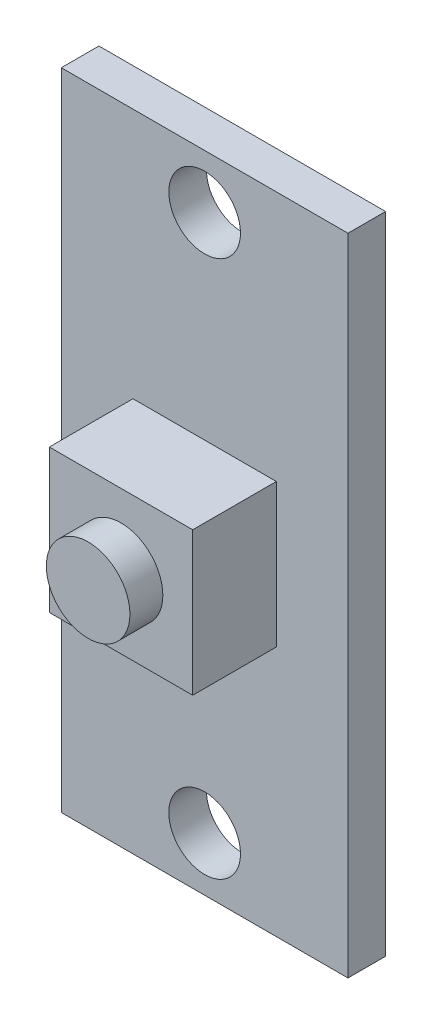
ISO-10303-21;
HEADER;
FILE_DESCRIPTION(('STEP AP214'),'2;1');
FILE_NAME('part.step','',(''),(''),'','','');
FILE_SCHEMA(('AUTOMOTIVE_DESIGN { 1 0 10303 214 1 1 1 1 }'));
ENDSEC;
DATA;
#1=APPLICATION_CONTEXT('core data for automotive mechanical design processes');
#2=APPLICATION_PROTOCOL_DEFINITION('international standard','automotive_design',2000,#1);
#3=PRODUCT_CONTEXT('',#1,'mechanical');
#4=PRODUCT('Part','Part','',(#3));
#5=PRODUCT_RELATED_PRODUCT_CATEGORY('part','',(#4));
#6=PRODUCT_DEFINITION_FORMATION('','',#4);
#7=PRODUCT_DEFINITION_CONTEXT('part definition',#1,'design');
#8=PRODUCT_DEFINITION('design','',#6,#7);
#9=PRODUCT_DEFINITION_SHAPE('','',#8);
#10=(LENGTH_UNIT() NAMED_UNIT(*) SI_UNIT(.MILLI.,.METRE.));
#11=(NAMED_UNIT(*) PLANE_ANGLE_UNIT() SI_UNIT($,.RADIAN.));
#12=(NAMED_UNIT(*) SI_UNIT($,.STERADIAN.) SOLID_ANGLE_UNIT());
#13=UNCERTAINTY_MEASURE_WITH_UNIT(LENGTH_MEASURE(1.E-05),#10,'distance_accuracy_value','');
#14=(GEOMETRIC_REPRESENTATION_CONTEXT(3) GLOBAL_UNCERTAINTY_ASSIGNED_CONTEXT((#13)) GLOBAL_UNIT_ASSIGNED_CONTEXT((#10,
#11,#12)) REPRESENTATION_CONTEXT('',''));
#15=CARTESIAN_POINT('',(0.,0.,0.));
#16=DIRECTION('',(0.,0.,1.));
#17=DIRECTION('',(1.,0.,0.));
#18=AXIS2_PLACEMENT_3D('',#15,#16,#17);
#19=CARTESIAN_POINT('',(0.,0.,1.6002));
#20=DIRECTION('',(0.,0.,-1.));
#21=DIRECTION('',(-1.,0.,0.));
#22=AXIS2_PLACEMENT_3D('',#19,#20,#21);
#23=PLANE('',#22);
#24=CARTESIAN_POINT('',(0.,11.43,1.6002));
#25=DIRECTION('',(0.,0.,-1.));
#26=DIRECTION('',(-1.,0.,0.));
#27=AXIS2_PLACEMENT_3D('',#24,#25,#26);
#28=CIRCLE('',#27,1.524);
#29=CARTESIAN_POINT('',(-1.524,11.43,1.6002));
#30=VERTEX_POINT('',#29);
#31=EDGE_CURVE('E295',#30,#30,#28,.T.);
#32=ORIENTED_EDGE('',*,*,#31,.T.);
#33=EDGE_LOOP('',(#32));
#34=FACE_BOUND('',#33,.T.);
#35=CARTESIAN_POINT('',(0.,-11.43,1.6002));
#36=DIRECTION('',(0.,0.,-1.));
#37=DIRECTION('',(-1.,0.,0.));
#38=AXIS2_PLACEMENT_3D('',#35,#36,#37);
#39=CIRCLE('',#38,1.524);
#40=CARTESIAN_POINT('',(-1.524,-11.43,1.6002));
#41=VERTEX_POINT('',#40);
#42=EDGE_CURVE('E291',#41,#41,#39,.T.);
#43=ORIENTED_EDGE('',*,*,#42,.T.);
#44=EDGE_LOOP('',(#43));
#45=FACE_BOUND('',#44,.T.);
#46=DIRECTION('',(0.,1.,0.));
#47=VECTOR('',#46,1.);
#48=CARTESIAN_POINT('',(6.096,-13.716,1.6002));
#49=LINE('',#48,#47);
#50=CARTESIAN_POINT('',(6.096,-13.716,1.6002));
#51=VERTEX_POINT('',#50);
#52=CARTESIAN_POINT('',(6.096,13.716,1.6002));
#53=VERTEX_POINT('',#52);
#54=EDGE_CURVE('E128',#51,#53,#49,.T.);
#55=ORIENTED_EDGE('',*,*,#54,.T.);
#56=DIRECTION('',(-1.,0.,0.));
#57=VECTOR('',#56,1.);
#58=CARTESIAN_POINT('',(-6.096,13.716,1.6002));
#59=LINE('',#58,#57);
#60=CARTESIAN_POINT('',(-6.096,13.716,1.6002));
#61=VERTEX_POINT('',#60);
#62=EDGE_CURVE('E131',#53,#61,#59,.T.);
#63=ORIENTED_EDGE('',*,*,#62,.T.);
#64=DIRECTION('',(0.,-1.,0.));
#65=VECTOR('',#64,1.);
#66=CARTESIAN_POINT('',(-6.096,-13.716,1.6002));
#67=LINE('',#66,#65);
#68=CARTESIAN_POINT('',(-6.096,-13.716,1.6002));
#69=VERTEX_POINT('',#68);
#70=EDGE_CURVE('E134',#61,#69,#67,.T.);
#71=ORIENTED_EDGE('',*,*,#70,.T.);
#72=DIRECTION('',(1.,0.,0.));
#73=VECTOR('',#72,1.);
#74=CARTESIAN_POINT('',(-6.096,-13.716,1.6002));
#75=LINE('',#74,#73);
#76=EDGE_CURVE('E136',#69,#51,#75,.T.);
#77=ORIENTED_EDGE('',*,*,#76,.T.);
#78=EDGE_LOOP('',(#55,#63,#71,#77));
#79=FACE_BOUND('',#78,.T.);
#80=DIRECTION('',(0.,-1.,0.));
#81=VECTOR('',#80,1.);
#82=CARTESIAN_POINT('',(-3.048,3.048,1.6002));
#83=LINE('',#82,#81);
#84=CARTESIAN_POINT('',(-3.048,3.048,1.6002));
#85=VERTEX_POINT('',#84);
#86=CARTESIAN_POINT('',(-3.048,-3.048,1.6002));
#87=VERTEX_POINT('',#86);
#88=EDGE_CURVE('E49',#85,#87,#83,.T.);
#89=ORIENTED_EDGE('',*,*,#88,.F.);
#90=DIRECTION('',(-1.,0.,0.));
#91=VECTOR('',#90,1.);
#92=CARTESIAN_POINT('',(-3.048,3.048,1.6002));
#93=LINE('',#92,#91);
#94=CARTESIAN_POINT('',(3.048,3.048,1.6002));
#95=VERTEX_POINT('',#94);
#96=EDGE_CURVE('E53',#95,#85,#93,.T.);
#97=ORIENTED_EDGE('',*,*,#96,.F.);
#98=DIRECTION('',(0.,1.,0.));
#99=VECTOR('',#98,1.);
#100=CARTESIAN_POINT('',(3.048,3.048,1.6002));
#101=LINE('',#100,#99);
#102=CARTESIAN_POINT('',(3.048,-3.048,1.6002));
#103=VERTEX_POINT('',#102);
#104=EDGE_CURVE('E303',#103,#95,#101,.T.);
#105=ORIENTED_EDGE('',*,*,#104,.F.);
#106=DIRECTION('',(1.,0.,0.));
#107=VECTOR('',#106,1.);
#108=CARTESIAN_POINT('',(-3.048,-3.048,1.6002));
#109=LINE('',#108,#107);
#110=EDGE_CURVE('E301',#87,#103,#109,.T.);
#111=ORIENTED_EDGE('',*,*,#110,.F.);
#112=EDGE_LOOP('',(#89,#97,#105,#111));
#113=FACE_BOUND('',#112,.T.);
#114=ADVANCED_FACE('F33',(#34,#45,#79,#113),#23,.F.);
#115=CARTESIAN_POINT('',(6.096,-13.716,1.6002));
#116=DIRECTION('',(-1.,0.,0.));
#117=DIRECTION('',(0.,0.,1.));
#118=AXIS2_PLACEMENT_3D('',#115,#116,#117);
#119=PLANE('',#118);
#120=DIRECTION('',(0.,1.,0.));
#121=VECTOR('',#120,1.);
#122=CARTESIAN_POINT('',(6.096,-13.716,0.));
#123=LINE('',#122,#121);
#124=CARTESIAN_POINT('',(6.096,-13.716,0.));
#125=VERTEX_POINT('',#124);
#126=CARTESIAN_POINT('',(6.096,13.716,0.));
#127=VERTEX_POINT('',#126);
#128=EDGE_CURVE('E119',#125,#127,#123,.T.);
#129=ORIENTED_EDGE('',*,*,#128,.T.);
#130=DIRECTION('',(0.,0.,-1.));
#131=VECTOR('',#130,1.);
#132=CARTESIAN_POINT('',(6.096,13.716,1.6002));
#133=LINE('',#132,#131);
#134=EDGE_CURVE('E37',#53,#127,#133,.T.);
#135=ORIENTED_EDGE('',*,*,#134,.F.);
#136=ORIENTED_EDGE('',*,*,#54,.F.);
#137=DIRECTION('',(0.,0.,-1.));
#138=VECTOR('',#137,1.);
#139=CARTESIAN_POINT('',(6.096,-13.716,1.6002));
#140=LINE('',#139,#138);
#141=EDGE_CURVE('E137',#51,#125,#140,.T.);
#142=ORIENTED_EDGE('',*,*,#141,.T.);
#143=EDGE_LOOP('',(#129,#135,#136,#142));
#144=FACE_BOUND('',#143,.T.);
#145=ADVANCED_FACE('F35',(#144),#119,.F.);
#146=CARTESIAN_POINT('',(-6.096,13.716,1.6002));
#147=DIRECTION('',(0.,-1.,0.));
#148=DIRECTION('',(0.,0.,-1.));
#149=AXIS2_PLACEMENT_3D('',#146,#147,#148);
#150=PLANE('',#149);
#151=DIRECTION('',(-1.,0.,0.));
#152=VECTOR('',#151,1.);
#153=CARTESIAN_POINT('',(-6.096,13.716,0.));
#154=LINE('',#153,#152);
#155=CARTESIAN_POINT('',(-6.096,13.716,0.));
#156=VERTEX_POINT('',#155);
#157=EDGE_CURVE('E122',#127,#156,#154,.T.);
#158=ORIENTED_EDGE('',*,*,#157,.T.);
#159=DIRECTION('',(0.,0.,-1.));
#160=VECTOR('',#159,1.);
#161=CARTESIAN_POINT('',(-6.096,13.716,1.6002));
#162=LINE('',#161,#160);
#163=EDGE_CURVE('E147',#61,#156,#162,.T.);
#164=ORIENTED_EDGE('',*,*,#163,.F.);
#165=ORIENTED_EDGE('',*,*,#62,.F.);
#166=ORIENTED_EDGE('',*,*,#134,.T.);
#167=EDGE_LOOP('',(#158,#164,#165,#166));
#168=FACE_BOUND('',#167,.T.);
#169=ADVANCED_FACE('F156',(#168),#150,.F.);
#170=CARTESIAN_POINT('',(-6.096,-13.716,1.6002));
#171=DIRECTION('',(1.,0.,0.));
#172=DIRECTION('',(0.,0.,-1.));
#173=AXIS2_PLACEMENT_3D('',#170,#171,#172);
#174=PLANE('',#173);
#175=DIRECTION('',(0.,-1.,0.));
#176=VECTOR('',#175,1.);
#177=CARTESIAN_POINT('',(-6.096,-13.716,0.));
#178=LINE('',#177,#176);
#179=CARTESIAN_POINT('',(-6.096,-13.716,0.));
#180=VERTEX_POINT('',#179);
#181=EDGE_CURVE('E140',#156,#180,#178,.T.);
#182=ORIENTED_EDGE('',*,*,#181,.T.);
#183=DIRECTION('',(0.,0.,-1.));
#184=VECTOR('',#183,1.);
#185=CARTESIAN_POINT('',(-6.096,-13.716,1.6002));
#186=LINE('',#185,#184);
#187=EDGE_CURVE('E145',#69,#180,#186,.T.);
#188=ORIENTED_EDGE('',*,*,#187,.F.);
#189=ORIENTED_EDGE('',*,*,#70,.F.);
#190=ORIENTED_EDGE('',*,*,#163,.T.);
#191=EDGE_LOOP('',(#182,#188,#189,#190));
#192=FACE_BOUND('',#191,.T.);
#193=ADVANCED_FACE('F165',(#192),#174,.F.);
#194=CARTESIAN_POINT('',(-6.096,-13.716,1.6002));
#195=DIRECTION('',(0.,1.,0.));
#196=DIRECTION('',(0.,0.,1.));
#197=AXIS2_PLACEMENT_3D('',#194,#195,#196);
#198=PLANE('',#197);
#199=DIRECTION('',(1.,0.,0.));
#200=VECTOR('',#199,1.);
#201=CARTESIAN_POINT('',(-6.096,-13.716,0.));
#202=LINE('',#201,#200);
#203=EDGE_CURVE('E132',#180,#125,#202,.T.);
#204=ORIENTED_EDGE('',*,*,#203,.T.);
#205=ORIENTED_EDGE('',*,*,#141,.F.);
#206=ORIENTED_EDGE('',*,*,#76,.F.);
#207=ORIENTED_EDGE('',*,*,#187,.T.);
#208=EDGE_LOOP('',(#204,#205,#206,#207));
#209=FACE_BOUND('',#208,.T.);
#210=ADVANCED_FACE('F168',(#209),#198,.F.);
#211=CARTESIAN_POINT('',(0.,0.,0.));
#212=DIRECTION('',(0.,0.,-1.));
#213=DIRECTION('',(-1.,0.,0.));
#214=AXIS2_PLACEMENT_3D('',#211,#212,#213);
#215=PLANE('',#214);
#216=CARTESIAN_POINT('',(0.,11.43,0.));
#217=DIRECTION('',(0.,0.,1.));
#218=DIRECTION('',(1.,0.,0.));
#219=AXIS2_PLACEMENT_3D('',#216,#217,#218);
#220=CIRCLE('',#219,1.524);
#221=CARTESIAN_POINT('',(1.524,11.43,0.));
#222=VERTEX_POINT('',#221);
#223=EDGE_CURVE('E287',#222,#222,#220,.T.);
#224=ORIENTED_EDGE('',*,*,#223,.T.);
#225=EDGE_LOOP('',(#224));
#226=FACE_BOUND('',#225,.T.);
#227=CARTESIAN_POINT('',(0.,-11.43,0.));
#228=DIRECTION('',(0.,0.,1.));
#229=DIRECTION('',(1.,0.,0.));
#230=AXIS2_PLACEMENT_3D('',#227,#228,#229);
#231=CIRCLE('',#230,1.524);
#232=CARTESIAN_POINT('',(1.524,-11.43,0.));
#233=VERTEX_POINT('',#232);
#234=EDGE_CURVE('E284',#233,#233,#231,.T.);
#235=ORIENTED_EDGE('',*,*,#234,.T.);
#236=EDGE_LOOP('',(#235));
#237=FACE_BOUND('',#236,.T.);
#238=ORIENTED_EDGE('',*,*,#128,.F.);
#239=ORIENTED_EDGE('',*,*,#203,.F.);
#240=ORIENTED_EDGE('',*,*,#181,.F.);
#241=ORIENTED_EDGE('',*,*,#157,.F.);
#242=EDGE_LOOP('',(#238,#239,#240,#241));
#243=FACE_BOUND('',#242,.T.);
#244=ADVANCED_FACE('F163',(#226,#237,#243),#215,.T.);
#245=CARTESIAN_POINT('',(-3.048,3.048,5.1562));
#246=DIRECTION('',(1.,0.,0.));
#247=DIRECTION('',(0.,1.,0.));
#248=AXIS2_PLACEMENT_3D('',#245,#246,#247);
#249=PLANE('',#248);
#250=ORIENTED_EDGE('',*,*,#88,.T.);
#251=DIRECTION('',(0.,0.,-1.));
#252=VECTOR('',#251,1.);
#253=CARTESIAN_POINT('',(-3.048,-3.048,5.1562));
#254=LINE('',#253,#252);
#255=CARTESIAN_POINT('',(-3.048,-3.048,5.1562));
#256=VERTEX_POINT('',#255);
#257=EDGE_CURVE('E102',#256,#87,#254,.T.);
#258=ORIENTED_EDGE('',*,*,#257,.F.);
#259=DIRECTION('',(0.,-1.,0.));
#260=VECTOR('',#259,1.);
#261=CARTESIAN_POINT('',(-3.048,3.048,5.1562));
#262=LINE('',#261,#260);
#263=CARTESIAN_POINT('',(-3.048,3.048,5.1562));
#264=VERTEX_POINT('',#263);
#265=EDGE_CURVE('E108',#264,#256,#262,.T.);
#266=ORIENTED_EDGE('',*,*,#265,.F.);
#267=DIRECTION('',(0.,0.,-1.));
#268=VECTOR('',#267,1.);
#269=CARTESIAN_POINT('',(-3.048,3.048,5.1562));
#270=LINE('',#269,#268);
#271=EDGE_CURVE('E299',#264,#85,#270,.T.);
#272=ORIENTED_EDGE('',*,*,#271,.T.);
#273=EDGE_LOOP('',(#250,#258,#266,#272));
#274=FACE_BOUND('',#273,.T.);
#275=ADVANCED_FACE('F118',(#274),#249,.F.);
#276=CARTESIAN_POINT('',(-3.048,-3.048,5.1562));
#277=DIRECTION('',(0.,1.,0.));
#278=DIRECTION('',(-1.,0.,0.));
#279=AXIS2_PLACEMENT_3D('',#276,#277,#278);
#280=PLANE('',#279);
#281=ORIENTED_EDGE('',*,*,#110,.T.);
#282=DIRECTION('',(0.,0.,-1.));
#283=VECTOR('',#282,1.);
#284=CARTESIAN_POINT('',(3.048,-3.048,5.1562));
#285=LINE('',#284,#283);
#286=CARTESIAN_POINT('',(3.048,-3.048,5.1562));
#287=VERTEX_POINT('',#286);
#288=EDGE_CURVE('E104',#287,#103,#285,.T.);
#289=ORIENTED_EDGE('',*,*,#288,.F.);
#290=DIRECTION('',(1.,0.,0.));
#291=VECTOR('',#290,1.);
#292=CARTESIAN_POINT('',(-3.048,-3.048,5.1562));
#293=LINE('',#292,#291);
#294=EDGE_CURVE('E97',#256,#287,#293,.T.);
#295=ORIENTED_EDGE('',*,*,#294,.F.);
#296=ORIENTED_EDGE('',*,*,#257,.T.);
#297=EDGE_LOOP('',(#281,#289,#295,#296));
#298=FACE_BOUND('',#297,.T.);
#299=ADVANCED_FACE('F100',(#298),#280,.F.);
#300=CARTESIAN_POINT('',(3.048,3.048,5.1562));
#301=DIRECTION('',(-1.,0.,0.));
#302=DIRECTION('',(0.,-1.,0.));
#303=AXIS2_PLACEMENT_3D('',#300,#301,#302);
#304=PLANE('',#303);
#305=ORIENTED_EDGE('',*,*,#104,.T.);
#306=DIRECTION('',(0.,0.,-1.));
#307=VECTOR('',#306,1.);
#308=CARTESIAN_POINT('',(3.048,3.048,5.1562));
#309=LINE('',#308,#307);
#310=CARTESIAN_POINT('',(3.048,3.048,5.1562));
#311=VERTEX_POINT('',#310);
#312=EDGE_CURVE('E124',#311,#95,#309,.T.);
#313=ORIENTED_EDGE('',*,*,#312,.F.);
#314=DIRECTION('',(0.,1.,0.));
#315=VECTOR('',#314,1.);
#316=CARTESIAN_POINT('',(3.048,3.048,5.1562));
#317=LINE('',#316,#315);
#318=EDGE_CURVE('E107',#287,#311,#317,.T.);
#319=ORIENTED_EDGE('',*,*,#318,.F.);
#320=ORIENTED_EDGE('',*,*,#288,.T.);
#321=EDGE_LOOP('',(#305,#313,#319,#320));
#322=FACE_BOUND('',#321,.T.);
#323=ADVANCED_FACE('F216',(#322),#304,.F.);
#324=CARTESIAN_POINT('',(-3.048,3.048,5.1562));
#325=DIRECTION('',(0.,-1.,0.));
#326=DIRECTION('',(0.,0.,-1.));
#327=AXIS2_PLACEMENT_3D('',#324,#325,#326);
#328=PLANE('',#327);
#329=ORIENTED_EDGE('',*,*,#96,.T.);
#330=ORIENTED_EDGE('',*,*,#271,.F.);
#331=DIRECTION('',(-1.,0.,0.));
#332=VECTOR('',#331,1.);
#333=CARTESIAN_POINT('',(-3.048,3.048,5.1562));
#334=LINE('',#333,#332);
#335=EDGE_CURVE('E113',#311,#264,#334,.T.);
#336=ORIENTED_EDGE('',*,*,#335,.F.);
#337=ORIENTED_EDGE('',*,*,#312,.T.);
#338=EDGE_LOOP('',(#329,#330,#336,#337));
#339=FACE_BOUND('',#338,.T.);
#340=ADVANCED_FACE('F222',(#339),#328,.F.);
#341=CARTESIAN_POINT('',(0.,0.,5.1562));
#342=DIRECTION('',(0.,0.,1.));
#343=DIRECTION('',(1.,0.,0.));
#344=AXIS2_PLACEMENT_3D('',#341,#342,#343);
#345=PLANE('',#344);
#346=CARTESIAN_POINT('',(0.,0.,5.1562));
#347=DIRECTION('',(0.,0.,1.));
#348=DIRECTION('',(1.,0.,0.));
#349=AXIS2_PLACEMENT_3D('',#346,#347,#348);
#350=CIRCLE('',#349,1.778);
#351=CARTESIAN_POINT('',(1.778,0.,5.1562));
#352=VERTEX_POINT('',#351);
#353=EDGE_CURVE('E11',#352,#352,#350,.T.);
#354=ORIENTED_EDGE('',*,*,#353,.F.);
#355=EDGE_LOOP('',(#354));
#356=FACE_BOUND('',#355,.T.);
#357=ORIENTED_EDGE('',*,*,#265,.T.);
#358=ORIENTED_EDGE('',*,*,#294,.T.);
#359=ORIENTED_EDGE('',*,*,#318,.T.);
#360=ORIENTED_EDGE('',*,*,#335,.T.);
#361=EDGE_LOOP('',(#357,#358,#359,#360));
#362=FACE_BOUND('',#361,.T.);
#363=ADVANCED_FACE('F111',(#356,#362),#345,.T.);
#364=CARTESIAN_POINT('',(0.,-11.43,0.));
#365=DIRECTION('',(0.,0.,1.));
#366=DIRECTION('',(1.,0.,0.));
#367=AXIS2_PLACEMENT_3D('',#364,#365,#366);
#368=CYLINDRICAL_SURFACE('',#367,1.524);
#369=ORIENTED_EDGE('',*,*,#234,.F.);
#370=EDGE_LOOP('',(#369));
#371=FACE_BOUND('',#370,.T.);
#372=ORIENTED_EDGE('',*,*,#42,.F.);
#373=EDGE_LOOP('',(#372));
#374=FACE_BOUND('',#373,.T.);
#375=ADVANCED_FACE('F238',(#371,#374),#368,.F.);
#376=CARTESIAN_POINT('',(0.,11.43,0.));
#377=DIRECTION('',(0.,0.,1.));
#378=DIRECTION('',(1.,0.,0.));
#379=AXIS2_PLACEMENT_3D('',#376,#377,#378);
#380=CYLINDRICAL_SURFACE('',#379,1.524);
#381=ORIENTED_EDGE('',*,*,#223,.F.);
#382=EDGE_LOOP('',(#381));
#383=FACE_BOUND('',#382,.T.);
#384=ORIENTED_EDGE('',*,*,#31,.F.);
#385=EDGE_LOOP('',(#384));
#386=FACE_BOUND('',#385,.T.);
#387=ADVANCED_FACE('F249',(#383,#386),#380,.F.);
#388=CARTESIAN_POINT('',(0.,0.,6.55574));
#389=DIRECTION('',(0.,0.,-1.));
#390=DIRECTION('',(-1.,0.,0.));
#391=AXIS2_PLACEMENT_3D('',#388,#389,#390);
#392=CYLINDRICAL_SURFACE('',#391,1.778);
#393=CARTESIAN_POINT('',(0.,0.,6.55574));
#394=DIRECTION('',(0.,0.,1.));
#395=DIRECTION('',(1.,0.,0.));
#396=AXIS2_PLACEMENT_3D('',#393,#394,#395);
#397=CIRCLE('',#396,1.778);
#398=CARTESIAN_POINT('',(1.778,0.,6.55574));
#399=VERTEX_POINT('',#398);
#400=EDGE_CURVE('E283',#399,#399,#397,.T.);
#401=ORIENTED_EDGE('',*,*,#400,.F.);
#402=EDGE_LOOP('',(#401));
#403=FACE_BOUND('',#402,.T.);
#404=ORIENTED_EDGE('',*,*,#353,.T.);
#405=EDGE_LOOP('',(#404));
#406=FACE_BOUND('',#405,.T.);
#407=ADVANCED_FACE('F255',(#403,#406),#392,.T.);
#408=CARTESIAN_POINT('',(0.,0.,6.55574));
#409=DIRECTION('',(0.,0.,1.));
#410=DIRECTION('',(1.,0.,0.));
#411=AXIS2_PLACEMENT_3D('',#408,#409,#410);
#412=PLANE('',#411);
#413=ORIENTED_EDGE('',*,*,#400,.T.);
#414=EDGE_LOOP('',(#413));
#415=FACE_BOUND('',#414,.T.);
#416=ADVANCED_FACE('F262',(#415),#412,.T.);
#417=CLOSED_SHELL('',(#114,#145,#169,#193,#210,#244,#275,#299,#323,#340,#363,#375,#387,#407,#416));
#418=MANIFOLD_SOLID_BREP('B2',#417);
#419=ADVANCED_BREP_SHAPE_REPRESENTATION('',(#18,#418),#14);
#420=SHAPE_DEFINITION_REPRESENTATION(#9,#419);
ENDSEC;
END-ISO-10303-21;
